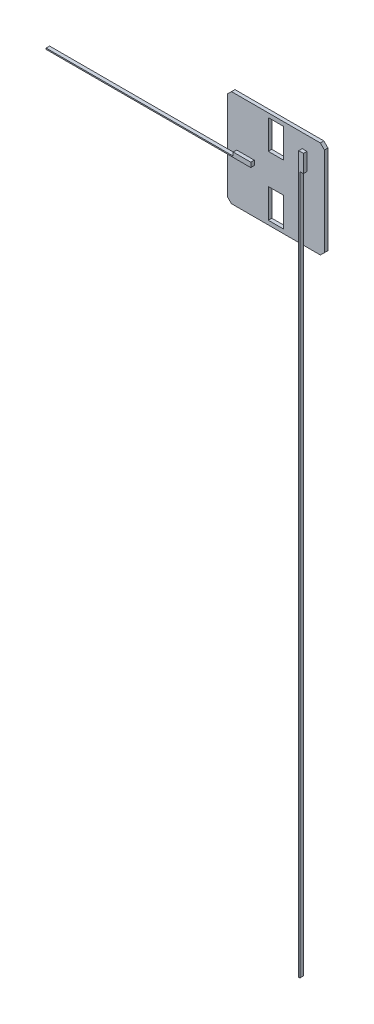
ISO-10303-21;
HEADER;
FILE_DESCRIPTION(('STEP AP214'),'2;1');
FILE_NAME('part.step','',(''),(''),'','','');
FILE_SCHEMA(('AUTOMOTIVE_DESIGN { 1 0 10303 214 1 1 1 1 }'));
ENDSEC;
DATA;
#1=APPLICATION_CONTEXT('core data for automotive mechanical design processes');
#2=APPLICATION_PROTOCOL_DEFINITION('international standard','automotive_design',2000,#1);
#3=PRODUCT_CONTEXT('',#1,'mechanical');
#4=PRODUCT('Part','Part','',(#3));
#5=PRODUCT_RELATED_PRODUCT_CATEGORY('part','',(#4));
#6=PRODUCT_DEFINITION_FORMATION('','',#4);
#7=PRODUCT_DEFINITION_CONTEXT('part definition',#1,'design');
#8=PRODUCT_DEFINITION('design','',#6,#7);
#9=PRODUCT_DEFINITION_SHAPE('','',#8);
#10=(LENGTH_UNIT() NAMED_UNIT(*) SI_UNIT(.MILLI.,.METRE.));
#11=(NAMED_UNIT(*) PLANE_ANGLE_UNIT() SI_UNIT($,.RADIAN.));
#12=(NAMED_UNIT(*) SI_UNIT($,.STERADIAN.) SOLID_ANGLE_UNIT());
#13=UNCERTAINTY_MEASURE_WITH_UNIT(LENGTH_MEASURE(1.E-05),#10,'distance_accuracy_value','');
#14=(GEOMETRIC_REPRESENTATION_CONTEXT(3) GLOBAL_UNCERTAINTY_ASSIGNED_CONTEXT((#13)) GLOBAL_UNIT_ASSIGNED_CONTEXT((#10,
#11,#12)) REPRESENTATION_CONTEXT('',''));
#15=CARTESIAN_POINT('',(0.,0.,0.));
#16=DIRECTION('',(0.,0.,1.));
#17=DIRECTION('',(1.,0.,0.));
#18=AXIS2_PLACEMENT_3D('',#15,#16,#17);
#19=CARTESIAN_POINT('',(0.,0.,3.));
#20=DIRECTION('',(0.,0.,1.));
#21=DIRECTION('',(1.,0.,0.));
#22=AXIS2_PLACEMENT_3D('',#19,#20,#21);
#23=PLANE('',#22);
#24=DIRECTION('',(1.,0.,0.));
#25=VECTOR('',#24,1.);
#26=CARTESIAN_POINT('',(-6.50000000000001,-38.,3.));
#27=LINE('',#26,#25);
#28=CARTESIAN_POINT('',(-6.50000000000001,-38.,3.));
#29=VERTEX_POINT('',#28);
#30=CARTESIAN_POINT('',(6.49999999999999,-38.,3.));
#31=VERTEX_POINT('',#30);
#32=EDGE_CURVE('E335',#29,#31,#27,.T.);
#33=ORIENTED_EDGE('',*,*,#32,.F.);
#34=DIRECTION('',(0.,-1.,0.));
#35=VECTOR('',#34,1.);
#36=CARTESIAN_POINT('',(-6.50000000000001,-38.,3.));
#37=LINE('',#36,#35);
#38=CARTESIAN_POINT('',(-6.50000000000001,-13.,3.));
#39=VERTEX_POINT('',#38);
#40=EDGE_CURVE('E340',#39,#29,#37,.T.);
#41=ORIENTED_EDGE('',*,*,#40,.F.);
#42=DIRECTION('',(-1.,0.,0.));
#43=VECTOR('',#42,1.);
#44=CARTESIAN_POINT('',(-6.50000000000001,-13.,3.));
#45=LINE('',#44,#43);
#46=CARTESIAN_POINT('',(6.49999999999999,-13.,3.));
#47=VERTEX_POINT('',#46);
#48=EDGE_CURVE('E354',#47,#39,#45,.T.);
#49=ORIENTED_EDGE('',*,*,#48,.F.);
#50=DIRECTION('',(0.,1.,0.));
#51=VECTOR('',#50,1.);
#52=CARTESIAN_POINT('',(6.49999999999999,-38.,3.));
#53=LINE('',#52,#51);
#54=EDGE_CURVE('E351',#31,#47,#53,.T.);
#55=ORIENTED_EDGE('',*,*,#54,.F.);
#56=EDGE_LOOP('',(#33,#41,#49,#55));
#57=FACE_BOUND('',#56,.T.);
#58=DIRECTION('',(0.,-1.,0.));
#59=VECTOR('',#58,1.);
#60=CARTESIAN_POINT('',(-6.50000000000001,38.,3.));
#61=LINE('',#60,#59);
#62=CARTESIAN_POINT('',(-6.50000000000001,38.,3.));
#63=VERTEX_POINT('',#62);
#64=CARTESIAN_POINT('',(-6.50000000000001,13.,3.));
#65=VERTEX_POINT('',#64);
#66=EDGE_CURVE('E361',#63,#65,#61,.T.);
#67=ORIENTED_EDGE('',*,*,#66,.F.);
#68=DIRECTION('',(-1.,0.,0.));
#69=VECTOR('',#68,1.);
#70=CARTESIAN_POINT('',(-6.50000000000001,38.,3.));
#71=LINE('',#70,#69);
#72=CARTESIAN_POINT('',(6.49999999999999,38.,3.));
#73=VERTEX_POINT('',#72);
#74=EDGE_CURVE('E372',#73,#63,#71,.T.);
#75=ORIENTED_EDGE('',*,*,#74,.F.);
#76=DIRECTION('',(0.,1.,0.));
#77=VECTOR('',#76,1.);
#78=CARTESIAN_POINT('',(6.49999999999999,38.,3.));
#79=LINE('',#78,#77);
#80=CARTESIAN_POINT('',(6.49999999999999,13.,3.));
#81=VERTEX_POINT('',#80);
#82=EDGE_CURVE('E386',#81,#73,#79,.T.);
#83=ORIENTED_EDGE('',*,*,#82,.F.);
#84=DIRECTION('',(1.,0.,0.));
#85=VECTOR('',#84,1.);
#86=CARTESIAN_POINT('',(-6.50000000000001,13.,3.));
#87=LINE('',#86,#85);
#88=EDGE_CURVE('E383',#65,#81,#87,.T.);
#89=ORIENTED_EDGE('',*,*,#88,.F.);
#90=EDGE_LOOP('',(#67,#75,#83,#89));
#91=FACE_BOUND('',#90,.T.);
#92=DIRECTION('',(0.,1.,0.));
#93=VECTOR('',#92,1.);
#94=CARTESIAN_POINT('',(-18.5,0.500000000000007,3.));
#95=LINE('',#94,#93);
#96=CARTESIAN_POINT('',(-18.5,-3.49999999999999,3.));
#97=VERTEX_POINT('',#96);
#98=CARTESIAN_POINT('',(-18.5,0.500000000000007,3.));
#99=VERTEX_POINT('',#98);
#100=EDGE_CURVE('E327',#97,#99,#95,.T.);
#101=ORIENTED_EDGE('',*,*,#100,.F.);
#102=DIRECTION('',(1.,0.,0.));
#103=VECTOR('',#102,1.);
#104=CARTESIAN_POINT('',(-193.5,-3.49999999999999,3.));
#105=LINE('',#104,#103);
#106=CARTESIAN_POINT('',(-41.5,-3.49999999999999,3.));
#107=VERTEX_POINT('',#106);
#108=EDGE_CURVE('E247',#107,#97,#105,.T.);
#109=ORIENTED_EDGE('',*,*,#108,.F.);
#110=DIRECTION('',(0.,-1.,0.));
#111=VECTOR('',#110,1.);
#112=CARTESIAN_POINT('',(-41.5,-41.5,3.));
#113=LINE('',#112,#111);
#114=CARTESIAN_POINT('',(-41.5,-38.,3.));
#115=VERTEX_POINT('',#114);
#116=EDGE_CURVE('E404',#107,#115,#113,.T.);
#117=ORIENTED_EDGE('',*,*,#116,.T.);
#118=DIRECTION('',(-0.707106781186546,0.707106781186549,0.));
#119=VECTOR('',#118,1.);
#120=CARTESIAN_POINT('',(-39.7500000000001,-39.7499999999999,3.));
#121=LINE('',#120,#119);
#122=CARTESIAN_POINT('',(-38.,-41.5,3.));
#123=VERTEX_POINT('',#122);
#124=EDGE_CURVE('E451',#115,#123,#121,.F.);
#125=ORIENTED_EDGE('',*,*,#124,.T.);
#126=DIRECTION('',(1.,0.,0.));
#127=VECTOR('',#126,1.);
#128=CARTESIAN_POINT('',(41.5,-41.5,3.));
#129=LINE('',#128,#127);
#130=CARTESIAN_POINT('',(22.5,-41.5,3.));
#131=VERTEX_POINT('',#130);
#132=EDGE_CURVE('E405',#123,#131,#129,.T.);
#133=ORIENTED_EDGE('',*,*,#132,.T.);
#134=DIRECTION('',(0.,-1.,0.));
#135=VECTOR('',#134,1.);
#136=CARTESIAN_POINT('',(22.5,-582.5,3.));
#137=LINE('',#136,#135);
#138=CARTESIAN_POINT('',(22.5,29.5,3.));
#139=VERTEX_POINT('',#138);
#140=EDGE_CURVE('E278',#139,#131,#137,.T.);
#141=ORIENTED_EDGE('',*,*,#140,.F.);
#142=DIRECTION('',(-1.,0.,0.));
#143=VECTOR('',#142,1.);
#144=CARTESIAN_POINT('',(23.5,29.5,3.));
#145=LINE('',#144,#143);
#146=CARTESIAN_POINT('',(26.5,29.5,3.));
#147=VERTEX_POINT('',#146);
#148=EDGE_CURVE('E300',#147,#139,#145,.T.);
#149=ORIENTED_EDGE('',*,*,#148,.F.);
#150=DIRECTION('',(0.,1.,0.));
#151=VECTOR('',#150,1.);
#152=CARTESIAN_POINT('',(26.5,29.5,3.));
#153=LINE('',#152,#151);
#154=CARTESIAN_POINT('',(26.5,14.5,3.));
#155=VERTEX_POINT('',#154);
#156=EDGE_CURVE('E305',#155,#147,#153,.T.);
#157=ORIENTED_EDGE('',*,*,#156,.F.);
#158=DIRECTION('',(1.,0.,0.));
#159=VECTOR('',#158,1.);
#160=CARTESIAN_POINT('',(23.5,14.5,3.));
#161=LINE('',#160,#159);
#162=CARTESIAN_POINT('',(23.5,14.5000000000001,3.));
#163=VERTEX_POINT('',#162);
#164=EDGE_CURVE('E296',#163,#155,#161,.T.);
#165=ORIENTED_EDGE('',*,*,#164,.F.);
#166=DIRECTION('',(0.,-1.,0.));
#167=VECTOR('',#166,1.);
#168=CARTESIAN_POINT('',(23.5,-582.5,3.));
#169=LINE('',#168,#167);
#170=CARTESIAN_POINT('',(23.5,-41.5,3.));
#171=VERTEX_POINT('',#170);
#172=EDGE_CURVE('E287',#163,#171,#169,.T.);
#173=ORIENTED_EDGE('',*,*,#172,.T.);
#174=CARTESIAN_POINT('',(38.,-41.5,3.));
#175=VERTEX_POINT('',#174);
#176=EDGE_CURVE('E403',#171,#175,#129,.T.);
#177=ORIENTED_EDGE('',*,*,#176,.T.);
#178=DIRECTION('',(-0.707106781186549,-0.707106781186546,0.));
#179=VECTOR('',#178,1.);
#180=CARTESIAN_POINT('',(39.7499999999999,-39.7500000000001,3.));
#181=LINE('',#180,#179);
#182=CARTESIAN_POINT('',(41.5,-38.,3.));
#183=VERTEX_POINT('',#182);
#184=EDGE_CURVE('E449',#175,#183,#181,.F.);
#185=ORIENTED_EDGE('',*,*,#184,.T.);
#186=DIRECTION('',(0.,1.,0.));
#187=VECTOR('',#186,1.);
#188=CARTESIAN_POINT('',(41.5,-41.5,3.));
#189=LINE('',#188,#187);
#190=CARTESIAN_POINT('',(41.5,38.,3.));
#191=VERTEX_POINT('',#190);
#192=EDGE_CURVE('E408',#183,#191,#189,.T.);
#193=ORIENTED_EDGE('',*,*,#192,.T.);
#194=DIRECTION('',(0.707106781186546,-0.707106781186549,0.));
#195=VECTOR('',#194,1.);
#196=CARTESIAN_POINT('',(39.7500000000001,39.7499999999999,3.));
#197=LINE('',#196,#195);
#198=CARTESIAN_POINT('',(38.,41.5,3.));
#199=VERTEX_POINT('',#198);
#200=EDGE_CURVE('E447',#191,#199,#197,.F.);
#201=ORIENTED_EDGE('',*,*,#200,.T.);
#202=DIRECTION('',(-1.,0.,0.));
#203=VECTOR('',#202,1.);
#204=CARTESIAN_POINT('',(41.5,41.5,3.));
#205=LINE('',#204,#203);
#206=CARTESIAN_POINT('',(-38.,41.5,3.));
#207=VERTEX_POINT('',#206);
#208=EDGE_CURVE('E411',#199,#207,#205,.T.);
#209=ORIENTED_EDGE('',*,*,#208,.T.);
#210=DIRECTION('',(0.707106781186549,0.707106781186546,0.));
#211=VECTOR('',#210,1.);
#212=CARTESIAN_POINT('',(-39.7499999999999,39.7500000000001,3.));
#213=LINE('',#212,#211);
#214=CARTESIAN_POINT('',(-41.5,38.,3.));
#215=VERTEX_POINT('',#214);
#216=EDGE_CURVE('E445',#207,#215,#213,.F.);
#217=ORIENTED_EDGE('',*,*,#216,.T.);
#218=CARTESIAN_POINT('',(-41.5,-2.49999999999999,3.));
#219=VERTEX_POINT('',#218);
#220=EDGE_CURVE('E400',#215,#219,#113,.T.);
#221=ORIENTED_EDGE('',*,*,#220,.T.);
#222=DIRECTION('',(1.,0.,0.));
#223=VECTOR('',#222,1.);
#224=CARTESIAN_POINT('',(-193.5,-2.49999999999999,3.));
#225=LINE('',#224,#223);
#226=CARTESIAN_POINT('',(-33.5,-2.49999999999999,3.));
#227=VERTEX_POINT('',#226);
#228=EDGE_CURVE('E491',#219,#227,#225,.T.);
#229=ORIENTED_EDGE('',*,*,#228,.T.);
#230=DIRECTION('',(0.,-1.,0.));
#231=VECTOR('',#230,1.);
#232=CARTESIAN_POINT('',(-33.5,0.500000000000007,3.));
#233=LINE('',#232,#231);
#234=CARTESIAN_POINT('',(-33.5,0.500000000000007,3.));
#235=VERTEX_POINT('',#234);
#236=EDGE_CURVE('E315',#235,#227,#233,.T.);
#237=ORIENTED_EDGE('',*,*,#236,.F.);
#238=DIRECTION('',(-1.,0.,0.));
#239=VECTOR('',#238,1.);
#240=CARTESIAN_POINT('',(-33.5,0.500000000000007,3.));
#241=LINE('',#240,#239);
#242=EDGE_CURVE('E320',#99,#235,#241,.T.);
#243=ORIENTED_EDGE('',*,*,#242,.F.);
#244=EDGE_LOOP('',(#101,#109,#117,#125,#133,#141,#149,#157,#165,#173,#177,#185,#193,#201,#209,
#217,#221,#229,#237,#243));
#245=FACE_BOUND('',#244,.T.);
#246=ADVANCED_FACE('F35',(#57,#91,#245),#23,.T.);
#247=CARTESIAN_POINT('',(-41.5,-41.5,3.));
#248=DIRECTION('',(1.,0.,0.));
#249=DIRECTION('',(0.,0.,-1.));
#250=AXIS2_PLACEMENT_3D('',#247,#248,#249);
#251=PLANE('',#250);
#252=DIRECTION('',(0.,-1.,0.));
#253=VECTOR('',#252,1.);
#254=CARTESIAN_POINT('',(-41.5,-41.5,0.));
#255=LINE('',#254,#253);
#256=CARTESIAN_POINT('',(-41.5,38.,0.));
#257=VERTEX_POINT('',#256);
#258=CARTESIAN_POINT('',(-41.5,-38.,0.));
#259=VERTEX_POINT('',#258);
#260=EDGE_CURVE('E393',#257,#259,#255,.T.);
#261=ORIENTED_EDGE('',*,*,#260,.T.);
#262=DIRECTION('',(0.,0.,1.));
#263=VECTOR('',#262,1.);
#264=CARTESIAN_POINT('',(-41.5,-38.,3.));
#265=LINE('',#264,#263);
#266=EDGE_CURVE('E442',#259,#115,#265,.T.);
#267=ORIENTED_EDGE('',*,*,#266,.T.);
#268=ORIENTED_EDGE('',*,*,#116,.F.);
#269=DIRECTION('',(0.,-1.,0.));
#270=VECTOR('',#269,1.);
#271=CARTESIAN_POINT('',(-41.5,-41.5,3.));
#272=LINE('',#271,#270);
#273=EDGE_CURVE('E242',#219,#107,#272,.T.);
#274=ORIENTED_EDGE('',*,*,#273,.F.);
#275=ORIENTED_EDGE('',*,*,#220,.F.);
#276=DIRECTION('',(0.,0.,-1.));
#277=VECTOR('',#276,1.);
#278=CARTESIAN_POINT('',(-41.5,38.,3.));
#279=LINE('',#278,#277);
#280=EDGE_CURVE('E439',#215,#257,#279,.T.);
#281=ORIENTED_EDGE('',*,*,#280,.T.);
#282=EDGE_LOOP('',(#261,#267,#268,#274,#275,#281));
#283=FACE_BOUND('',#282,.T.);
#284=ADVANCED_FACE('F471',(#283),#251,.F.);
#285=CARTESIAN_POINT('',(41.5,-41.5,3.));
#286=DIRECTION('',(0.,1.,0.));
#287=DIRECTION('',(-1.,0.,0.));
#288=AXIS2_PLACEMENT_3D('',#285,#286,#287);
#289=PLANE('',#288);
#290=ORIENTED_EDGE('',*,*,#132,.F.);
#291=DIRECTION('',(0.,0.,-1.));
#292=VECTOR('',#291,1.);
#293=CARTESIAN_POINT('',(-38.,-41.5,3.));
#294=LINE('',#293,#292);
#295=CARTESIAN_POINT('',(-38.,-41.5,0.));
#296=VERTEX_POINT('',#295);
#297=EDGE_CURVE('E428',#123,#296,#294,.T.);
#298=ORIENTED_EDGE('',*,*,#297,.T.);
#299=DIRECTION('',(1.,0.,0.));
#300=VECTOR('',#299,1.);
#301=CARTESIAN_POINT('',(41.5,-41.5,0.));
#302=LINE('',#301,#300);
#303=CARTESIAN_POINT('',(38.,-41.5,0.));
#304=VERTEX_POINT('',#303);
#305=EDGE_CURVE('E417',#296,#304,#302,.T.);
#306=ORIENTED_EDGE('',*,*,#305,.T.);
#307=DIRECTION('',(0.,0.,1.));
#308=VECTOR('',#307,1.);
#309=CARTESIAN_POINT('',(38.,-41.5,3.));
#310=LINE('',#309,#308);
#311=EDGE_CURVE('E414',#304,#175,#310,.T.);
#312=ORIENTED_EDGE('',*,*,#311,.T.);
#313=ORIENTED_EDGE('',*,*,#176,.F.);
#314=DIRECTION('',(1.,0.,0.));
#315=VECTOR('',#314,1.);
#316=CARTESIAN_POINT('',(41.5,-41.5,3.));
#317=LINE('',#316,#315);
#318=EDGE_CURVE('E294',#131,#171,#317,.T.);
#319=ORIENTED_EDGE('',*,*,#318,.F.);
#320=EDGE_LOOP('',(#290,#298,#306,#312,#313,#319));
#321=FACE_BOUND('',#320,.T.);
#322=ADVANCED_FACE('F482',(#321),#289,.F.);
#323=CARTESIAN_POINT('',(41.5,-41.5,3.));
#324=DIRECTION('',(-1.,0.,0.));
#325=DIRECTION('',(0.,0.,1.));
#326=AXIS2_PLACEMENT_3D('',#323,#324,#325);
#327=PLANE('',#326);
#328=ORIENTED_EDGE('',*,*,#192,.F.);
#329=DIRECTION('',(0.,0.,-1.));
#330=VECTOR('',#329,1.);
#331=CARTESIAN_POINT('',(41.5,-38.,3.));
#332=LINE('',#331,#330);
#333=CARTESIAN_POINT('',(41.5,-38.,0.));
#334=VERTEX_POINT('',#333);
#335=EDGE_CURVE('E455',#183,#334,#332,.T.);
#336=ORIENTED_EDGE('',*,*,#335,.T.);
#337=DIRECTION('',(0.,1.,0.));
#338=VECTOR('',#337,1.);
#339=CARTESIAN_POINT('',(41.5,-41.5,0.));
#340=LINE('',#339,#338);
#341=CARTESIAN_POINT('',(41.5,38.,0.));
#342=VERTEX_POINT('',#341);
#343=EDGE_CURVE('E420',#334,#342,#340,.T.);
#344=ORIENTED_EDGE('',*,*,#343,.T.);
#345=DIRECTION('',(0.,0.,1.));
#346=VECTOR('',#345,1.);
#347=CARTESIAN_POINT('',(41.5,38.,3.));
#348=LINE('',#347,#346);
#349=EDGE_CURVE('E453',#342,#191,#348,.T.);
#350=ORIENTED_EDGE('',*,*,#349,.T.);
#351=EDGE_LOOP('',(#328,#336,#344,#350));
#352=FACE_BOUND('',#351,.T.);
#353=ADVANCED_FACE('F539',(#352),#327,.F.);
#354=CARTESIAN_POINT('',(41.5,41.5,3.));
#355=DIRECTION('',(0.,-1.,0.));
#356=DIRECTION('',(1.,0.,0.));
#357=AXIS2_PLACEMENT_3D('',#354,#355,#356);
#358=PLANE('',#357);
#359=ORIENTED_EDGE('',*,*,#208,.F.);
#360=DIRECTION('',(0.,0.,-1.));
#361=VECTOR('',#360,1.);
#362=CARTESIAN_POINT('',(38.,41.5,3.));
#363=LINE('',#362,#361);
#364=CARTESIAN_POINT('',(38.,41.5,0.));
#365=VERTEX_POINT('',#364);
#366=EDGE_CURVE('E11',#199,#365,#363,.T.);
#367=ORIENTED_EDGE('',*,*,#366,.T.);
#368=DIRECTION('',(-1.,0.,0.));
#369=VECTOR('',#368,1.);
#370=CARTESIAN_POINT('',(41.5,41.5,0.));
#371=LINE('',#370,#369);
#372=CARTESIAN_POINT('',(-38.,41.5,0.));
#373=VERTEX_POINT('',#372);
#374=EDGE_CURVE('E423',#365,#373,#371,.T.);
#375=ORIENTED_EDGE('',*,*,#374,.T.);
#376=DIRECTION('',(0.,0.,1.));
#377=VECTOR('',#376,1.);
#378=CARTESIAN_POINT('',(-38.,41.5,3.));
#379=LINE('',#378,#377);
#380=EDGE_CURVE('E43',#373,#207,#379,.T.);
#381=ORIENTED_EDGE('',*,*,#380,.T.);
#382=EDGE_LOOP('',(#359,#367,#375,#381));
#383=FACE_BOUND('',#382,.T.);
#384=ADVANCED_FACE('F460',(#383),#358,.F.);
#385=CARTESIAN_POINT('',(0.,0.,0.));
#386=DIRECTION('',(0.,0.,1.));
#387=DIRECTION('',(1.,0.,0.));
#388=AXIS2_PLACEMENT_3D('',#385,#386,#387);
#389=PLANE('',#388);
#390=DIRECTION('',(0.,-1.,0.));
#391=VECTOR('',#390,1.);
#392=CARTESIAN_POINT('',(-6.50000000000001,-38.,0.));
#393=LINE('',#392,#391);
#394=CARTESIAN_POINT('',(-6.50000000000001,-13.,0.));
#395=VERTEX_POINT('',#394);
#396=CARTESIAN_POINT('',(-6.50000000000001,-38.,0.));
#397=VERTEX_POINT('',#396);
#398=EDGE_CURVE('E346',#395,#397,#393,.T.);
#399=ORIENTED_EDGE('',*,*,#398,.T.);
#400=DIRECTION('',(1.,0.,0.));
#401=VECTOR('',#400,1.);
#402=CARTESIAN_POINT('',(-6.50000000000001,-38.,0.));
#403=LINE('',#402,#401);
#404=CARTESIAN_POINT('',(6.49999999999999,-38.,0.));
#405=VERTEX_POINT('',#404);
#406=EDGE_CURVE('E336',#397,#405,#403,.T.);
#407=ORIENTED_EDGE('',*,*,#406,.T.);
#408=DIRECTION('',(0.,1.,0.));
#409=VECTOR('',#408,1.);
#410=CARTESIAN_POINT('',(6.49999999999999,-38.,0.));
#411=LINE('',#410,#409);
#412=CARTESIAN_POINT('',(6.49999999999999,-13.,0.));
#413=VERTEX_POINT('',#412);
#414=EDGE_CURVE('E339',#405,#413,#411,.T.);
#415=ORIENTED_EDGE('',*,*,#414,.T.);
#416=DIRECTION('',(-1.,0.,0.));
#417=VECTOR('',#416,1.);
#418=CARTESIAN_POINT('',(-6.50000000000001,-13.,0.));
#419=LINE('',#418,#417);
#420=EDGE_CURVE('E343',#413,#395,#419,.T.);
#421=ORIENTED_EDGE('',*,*,#420,.T.);
#422=EDGE_LOOP('',(#399,#407,#415,#421));
#423=FACE_BOUND('',#422,.T.);
#424=DIRECTION('',(-1.,0.,0.));
#425=VECTOR('',#424,1.);
#426=CARTESIAN_POINT('',(-6.50000000000001,38.,0.));
#427=LINE('',#426,#425);
#428=CARTESIAN_POINT('',(6.49999999999999,38.,0.));
#429=VERTEX_POINT('',#428);
#430=CARTESIAN_POINT('',(-6.50000000000001,38.,0.));
#431=VERTEX_POINT('',#430);
#432=EDGE_CURVE('E378',#429,#431,#427,.T.);
#433=ORIENTED_EDGE('',*,*,#432,.T.);
#434=DIRECTION('',(0.,-1.,0.));
#435=VECTOR('',#434,1.);
#436=CARTESIAN_POINT('',(-6.50000000000001,38.,0.));
#437=LINE('',#436,#435);
#438=CARTESIAN_POINT('',(-6.50000000000001,13.,0.));
#439=VERTEX_POINT('',#438);
#440=EDGE_CURVE('E368',#431,#439,#437,.T.);
#441=ORIENTED_EDGE('',*,*,#440,.T.);
#442=DIRECTION('',(1.,0.,0.));
#443=VECTOR('',#442,1.);
#444=CARTESIAN_POINT('',(-6.50000000000001,13.,0.));
#445=LINE('',#444,#443);
#446=CARTESIAN_POINT('',(6.49999999999999,13.,0.));
#447=VERTEX_POINT('',#446);
#448=EDGE_CURVE('E371',#439,#447,#445,.T.);
#449=ORIENTED_EDGE('',*,*,#448,.T.);
#450=DIRECTION('',(0.,1.,0.));
#451=VECTOR('',#450,1.);
#452=CARTESIAN_POINT('',(6.49999999999999,38.,0.));
#453=LINE('',#452,#451);
#454=EDGE_CURVE('E375',#447,#429,#453,.T.);
#455=ORIENTED_EDGE('',*,*,#454,.T.);
#456=EDGE_LOOP('',(#433,#441,#449,#455));
#457=FACE_BOUND('',#456,.T.);
#458=ORIENTED_EDGE('',*,*,#305,.F.);
#459=DIRECTION('',(0.707106781186546,-0.707106781186549,0.));
#460=VECTOR('',#459,1.);
#461=CARTESIAN_POINT('',(-38.,-41.5,0.));
#462=LINE('',#461,#460);
#463=EDGE_CURVE('E437',#296,#259,#462,.F.);
#464=ORIENTED_EDGE('',*,*,#463,.T.);
#465=ORIENTED_EDGE('',*,*,#260,.F.);
#466=DIRECTION('',(-0.707106781186549,-0.707106781186546,0.));
#467=VECTOR('',#466,1.);
#468=CARTESIAN_POINT('',(-41.5,38.,0.));
#469=LINE('',#468,#467);
#470=EDGE_CURVE('E431',#257,#373,#469,.F.);
#471=ORIENTED_EDGE('',*,*,#470,.T.);
#472=ORIENTED_EDGE('',*,*,#374,.F.);
#473=DIRECTION('',(-0.707106781186546,0.707106781186549,0.));
#474=VECTOR('',#473,1.);
#475=CARTESIAN_POINT('',(38.,41.5,0.));
#476=LINE('',#475,#474);
#477=EDGE_CURVE('E433',#365,#342,#476,.F.);
#478=ORIENTED_EDGE('',*,*,#477,.T.);
#479=ORIENTED_EDGE('',*,*,#343,.F.);
#480=DIRECTION('',(0.707106781186549,0.707106781186546,0.));
#481=VECTOR('',#480,1.);
#482=CARTESIAN_POINT('',(41.5,-38.,0.));
#483=LINE('',#482,#481);
#484=EDGE_CURVE('E435',#334,#304,#483,.F.);
#485=ORIENTED_EDGE('',*,*,#484,.T.);
#486=EDGE_LOOP('',(#458,#464,#465,#471,#472,#478,#479,#485));
#487=FACE_BOUND('',#486,.T.);
#488=ADVANCED_FACE('F475',(#423,#457,#487),#389,.F.);
#489=CARTESIAN_POINT('',(-6.50000000000001,38.,0.));
#490=DIRECTION('',(-1.,0.,0.));
#491=DIRECTION('',(0.,-1.,0.));
#492=AXIS2_PLACEMENT_3D('',#489,#490,#491);
#493=PLANE('',#492);
#494=ORIENTED_EDGE('',*,*,#66,.T.);
#495=DIRECTION('',(0.,0.,1.));
#496=VECTOR('',#495,1.);
#497=CARTESIAN_POINT('',(-6.50000000000001,13.,0.));
#498=LINE('',#497,#496);
#499=EDGE_CURVE('E381',#439,#65,#498,.T.);
#500=ORIENTED_EDGE('',*,*,#499,.F.);
#501=ORIENTED_EDGE('',*,*,#440,.F.);
#502=DIRECTION('',(0.,0.,1.));
#503=VECTOR('',#502,1.);
#504=CARTESIAN_POINT('',(-6.50000000000001,38.,0.));
#505=LINE('',#504,#503);
#506=EDGE_CURVE('E391',#431,#63,#505,.T.);
#507=ORIENTED_EDGE('',*,*,#506,.T.);
#508=EDGE_LOOP('',(#494,#500,#501,#507));
#509=FACE_BOUND('',#508,.T.);
#510=ADVANCED_FACE('F532',(#509),#493,.F.);
#511=CARTESIAN_POINT('',(-6.50000000000001,38.,0.));
#512=DIRECTION('',(0.,1.,0.));
#513=DIRECTION('',(-1.,0.,0.));
#514=AXIS2_PLACEMENT_3D('',#511,#512,#513);
#515=PLANE('',#514);
#516=ORIENTED_EDGE('',*,*,#74,.T.);
#517=ORIENTED_EDGE('',*,*,#506,.F.);
#518=ORIENTED_EDGE('',*,*,#432,.F.);
#519=DIRECTION('',(0.,0.,1.));
#520=VECTOR('',#519,1.);
#521=CARTESIAN_POINT('',(6.49999999999999,38.,0.));
#522=LINE('',#521,#520);
#523=EDGE_CURVE('E394',#429,#73,#522,.T.);
#524=ORIENTED_EDGE('',*,*,#523,.T.);
#525=EDGE_LOOP('',(#516,#517,#518,#524));
#526=FACE_BOUND('',#525,.T.);
#527=ADVANCED_FACE('F625',(#526),#515,.F.);
#528=CARTESIAN_POINT('',(6.49999999999999,38.,0.));
#529=DIRECTION('',(1.,0.,0.));
#530=DIRECTION('',(0.,1.,0.));
#531=AXIS2_PLACEMENT_3D('',#528,#529,#530);
#532=PLANE('',#531);
#533=ORIENTED_EDGE('',*,*,#82,.T.);
#534=ORIENTED_EDGE('',*,*,#523,.F.);
#535=ORIENTED_EDGE('',*,*,#454,.F.);
#536=DIRECTION('',(0.,0.,1.));
#537=VECTOR('',#536,1.);
#538=CARTESIAN_POINT('',(6.49999999999999,13.,0.));
#539=LINE('',#538,#537);
#540=EDGE_CURVE('E396',#447,#81,#539,.T.);
#541=ORIENTED_EDGE('',*,*,#540,.T.);
#542=EDGE_LOOP('',(#533,#534,#535,#541));
#543=FACE_BOUND('',#542,.T.);
#544=ADVANCED_FACE('F628',(#543),#532,.F.);
#545=CARTESIAN_POINT('',(-6.50000000000001,13.,0.));
#546=DIRECTION('',(0.,-1.,0.));
#547=DIRECTION('',(1.,0.,0.));
#548=AXIS2_PLACEMENT_3D('',#545,#546,#547);
#549=PLANE('',#548);
#550=ORIENTED_EDGE('',*,*,#88,.T.);
#551=ORIENTED_EDGE('',*,*,#540,.F.);
#552=ORIENTED_EDGE('',*,*,#448,.F.);
#553=ORIENTED_EDGE('',*,*,#499,.T.);
#554=EDGE_LOOP('',(#550,#551,#552,#553));
#555=FACE_BOUND('',#554,.T.);
#556=ADVANCED_FACE('F623',(#555),#549,.F.);
#557=CARTESIAN_POINT('',(-6.50000000000001,-38.,0.));
#558=DIRECTION('',(0.,-1.,0.));
#559=DIRECTION('',(1.,0.,0.));
#560=AXIS2_PLACEMENT_3D('',#557,#558,#559);
#561=PLANE('',#560);
#562=ORIENTED_EDGE('',*,*,#32,.T.);
#563=DIRECTION('',(0.,0.,1.));
#564=VECTOR('',#563,1.);
#565=CARTESIAN_POINT('',(6.49999999999999,-38.,0.));
#566=LINE('',#565,#564);
#567=EDGE_CURVE('E349',#405,#31,#566,.T.);
#568=ORIENTED_EDGE('',*,*,#567,.F.);
#569=ORIENTED_EDGE('',*,*,#406,.F.);
#570=DIRECTION('',(0.,0.,1.));
#571=VECTOR('',#570,1.);
#572=CARTESIAN_POINT('',(-6.50000000000001,-38.,0.));
#573=LINE('',#572,#571);
#574=EDGE_CURVE('E359',#397,#29,#573,.T.);
#575=ORIENTED_EDGE('',*,*,#574,.T.);
#576=EDGE_LOOP('',(#562,#568,#569,#575));
#577=FACE_BOUND('',#576,.T.);
#578=ADVANCED_FACE('F613',(#577),#561,.F.);
#579=CARTESIAN_POINT('',(-6.50000000000001,-38.,0.));
#580=DIRECTION('',(-1.,0.,0.));
#581=DIRECTION('',(0.,-1.,0.));
#582=AXIS2_PLACEMENT_3D('',#579,#580,#581);
#583=PLANE('',#582);
#584=ORIENTED_EDGE('',*,*,#40,.T.);
#585=ORIENTED_EDGE('',*,*,#574,.F.);
#586=ORIENTED_EDGE('',*,*,#398,.F.);
#587=DIRECTION('',(0.,0.,1.));
#588=VECTOR('',#587,1.);
#589=CARTESIAN_POINT('',(-6.50000000000001,-13.,0.));
#590=LINE('',#589,#588);
#591=EDGE_CURVE('E362',#395,#39,#590,.T.);
#592=ORIENTED_EDGE('',*,*,#591,.T.);
#593=EDGE_LOOP('',(#584,#585,#586,#592));
#594=FACE_BOUND('',#593,.T.);
#595=ADVANCED_FACE('F609',(#594),#583,.F.);
#596=CARTESIAN_POINT('',(-6.50000000000001,-13.,0.));
#597=DIRECTION('',(0.,1.,0.));
#598=DIRECTION('',(-1.,0.,0.));
#599=AXIS2_PLACEMENT_3D('',#596,#597,#598);
#600=PLANE('',#599);
#601=ORIENTED_EDGE('',*,*,#48,.T.);
#602=ORIENTED_EDGE('',*,*,#591,.F.);
#603=ORIENTED_EDGE('',*,*,#420,.F.);
#604=DIRECTION('',(0.,0.,1.));
#605=VECTOR('',#604,1.);
#606=CARTESIAN_POINT('',(6.49999999999999,-13.,0.));
#607=LINE('',#606,#605);
#608=EDGE_CURVE('E364',#413,#47,#607,.T.);
#609=ORIENTED_EDGE('',*,*,#608,.T.);
#610=EDGE_LOOP('',(#601,#602,#603,#609));
#611=FACE_BOUND('',#610,.T.);
#612=ADVANCED_FACE('F612',(#611),#600,.F.);
#613=CARTESIAN_POINT('',(6.49999999999999,-38.,0.));
#614=DIRECTION('',(1.,0.,0.));
#615=DIRECTION('',(0.,1.,0.));
#616=AXIS2_PLACEMENT_3D('',#613,#614,#615);
#617=PLANE('',#616);
#618=ORIENTED_EDGE('',*,*,#54,.T.);
#619=ORIENTED_EDGE('',*,*,#608,.F.);
#620=ORIENTED_EDGE('',*,*,#414,.F.);
#621=ORIENTED_EDGE('',*,*,#567,.T.);
#622=EDGE_LOOP('',(#618,#619,#620,#621));
#623=FACE_BOUND('',#622,.T.);
#624=ADVANCED_FACE('F548',(#623),#617,.F.);
#625=CARTESIAN_POINT('',(-38.,-41.5,3.));
#626=DIRECTION('',(0.707106781186549,0.707106781186546,0.));
#627=DIRECTION('',(0.,0.,-1.));
#628=AXIS2_PLACEMENT_3D('',#625,#626,#627);
#629=PLANE('',#628);
#630=ORIENTED_EDGE('',*,*,#124,.F.);
#631=ORIENTED_EDGE('',*,*,#266,.F.);
#632=ORIENTED_EDGE('',*,*,#463,.F.);
#633=ORIENTED_EDGE('',*,*,#297,.F.);
#634=EDGE_LOOP('',(#630,#631,#632,#633));
#635=FACE_BOUND('',#634,.T.);
#636=ADVANCED_FACE('F479',(#635),#629,.F.);
#637=CARTESIAN_POINT('',(41.5,-38.,3.));
#638=DIRECTION('',(-0.707106781186546,0.707106781186549,0.));
#639=DIRECTION('',(0.,0.,-1.));
#640=AXIS2_PLACEMENT_3D('',#637,#638,#639);
#641=PLANE('',#640);
#642=ORIENTED_EDGE('',*,*,#184,.F.);
#643=ORIENTED_EDGE('',*,*,#311,.F.);
#644=ORIENTED_EDGE('',*,*,#484,.F.);
#645=ORIENTED_EDGE('',*,*,#335,.F.);
#646=EDGE_LOOP('',(#642,#643,#644,#645));
#647=FACE_BOUND('',#646,.T.);
#648=ADVANCED_FACE('F547',(#647),#641,.F.);
#649=CARTESIAN_POINT('',(38.,41.5,3.));
#650=DIRECTION('',(-0.707106781186549,-0.707106781186546,0.));
#651=DIRECTION('',(0.,0.,-1.));
#652=AXIS2_PLACEMENT_3D('',#649,#650,#651);
#653=PLANE('',#652);
#654=ORIENTED_EDGE('',*,*,#200,.F.);
#655=ORIENTED_EDGE('',*,*,#349,.F.);
#656=ORIENTED_EDGE('',*,*,#477,.F.);
#657=ORIENTED_EDGE('',*,*,#366,.F.);
#658=EDGE_LOOP('',(#654,#655,#656,#657));
#659=FACE_BOUND('',#658,.T.);
#660=ADVANCED_FACE('F550',(#659),#653,.F.);
#661=CARTESIAN_POINT('',(-41.5,38.,3.));
#662=DIRECTION('',(0.707106781186546,-0.707106781186549,0.));
#663=DIRECTION('',(0.,0.,-1.));
#664=AXIS2_PLACEMENT_3D('',#661,#662,#663);
#665=PLANE('',#664);
#666=ORIENTED_EDGE('',*,*,#216,.F.);
#667=ORIENTED_EDGE('',*,*,#380,.F.);
#668=ORIENTED_EDGE('',*,*,#470,.F.);
#669=ORIENTED_EDGE('',*,*,#280,.F.);
#670=EDGE_LOOP('',(#666,#667,#668,#669));
#671=FACE_BOUND('',#670,.T.);
#672=ADVANCED_FACE('F37',(#671),#665,.F.);
#673=CARTESIAN_POINT('',(-33.5,0.500000000000007,6.));
#674=DIRECTION('',(1.,0.,0.));
#675=DIRECTION('',(0.,0.,-1.));
#676=AXIS2_PLACEMENT_3D('',#673,#674,#675);
#677=PLANE('',#676);
#678=ORIENTED_EDGE('',*,*,#236,.T.);
#679=DIRECTION('',(0.,0.,-1.));
#680=VECTOR('',#679,1.);
#681=CARTESIAN_POINT('',(-33.5,-2.49999999999999,6.));
#682=LINE('',#681,#680);
#683=CARTESIAN_POINT('',(-33.5,-2.49999999999999,6.));
#684=VERTEX_POINT('',#683);
#685=EDGE_CURVE('E333',#684,#227,#682,.T.);
#686=ORIENTED_EDGE('',*,*,#685,.F.);
#687=DIRECTION('',(0.,-1.,0.));
#688=VECTOR('',#687,1.);
#689=CARTESIAN_POINT('',(-33.5,0.500000000000007,6.));
#690=LINE('',#689,#688);
#691=CARTESIAN_POINT('',(-33.5,0.500000000000007,6.));
#692=VERTEX_POINT('',#691);
#693=EDGE_CURVE('E316',#692,#684,#690,.T.);
#694=ORIENTED_EDGE('',*,*,#693,.F.);
#695=DIRECTION('',(0.,0.,-1.));
#696=VECTOR('',#695,1.);
#697=CARTESIAN_POINT('',(-33.5,0.500000000000007,6.));
#698=LINE('',#697,#696);
#699=EDGE_CURVE('E324',#692,#235,#698,.T.);
#700=ORIENTED_EDGE('',*,*,#699,.T.);
#701=EDGE_LOOP('',(#678,#686,#694,#700));
#702=FACE_BOUND('',#701,.T.);
#703=ADVANCED_FACE('F498',(#702),#677,.F.);
#704=CARTESIAN_POINT('',(-18.5,0.500000000000007,6.));
#705=DIRECTION('',(-1.,0.,0.));
#706=DIRECTION('',(0.,0.,1.));
#707=AXIS2_PLACEMENT_3D('',#704,#705,#706);
#708=PLANE('',#707);
#709=ORIENTED_EDGE('',*,*,#100,.T.);
#710=DIRECTION('',(0.,0.,-1.));
#711=VECTOR('',#710,1.);
#712=CARTESIAN_POINT('',(-18.5,0.500000000000007,6.));
#713=LINE('',#712,#711);
#714=CARTESIAN_POINT('',(-18.5,0.500000000000007,6.));
#715=VERTEX_POINT('',#714);
#716=EDGE_CURVE('E58',#715,#99,#713,.T.);
#717=ORIENTED_EDGE('',*,*,#716,.F.);
#718=DIRECTION('',(0.,1.,0.));
#719=VECTOR('',#718,1.);
#720=CARTESIAN_POINT('',(-18.5,0.500000000000007,6.));
#721=LINE('',#720,#719);
#722=CARTESIAN_POINT('',(-18.5,-3.49999999999999,6.));
#723=VERTEX_POINT('',#722);
#724=EDGE_CURVE('E319',#723,#715,#721,.T.);
#725=ORIENTED_EDGE('',*,*,#724,.F.);
#726=DIRECTION('',(0.,0.,1.));
#727=VECTOR('',#726,1.);
#728=CARTESIAN_POINT('',(-18.5,-3.49999999999999,3.));
#729=LINE('',#728,#727);
#730=EDGE_CURVE('E246',#97,#723,#729,.T.);
#731=ORIENTED_EDGE('',*,*,#730,.F.);
#732=EDGE_LOOP('',(#709,#717,#725,#731));
#733=FACE_BOUND('',#732,.T.);
#734=ADVANCED_FACE('F504',(#733),#708,.F.);
#735=CARTESIAN_POINT('',(-33.5,0.500000000000007,6.));
#736=DIRECTION('',(0.,-1.,0.));
#737=DIRECTION('',(0.,0.,-1.));
#738=AXIS2_PLACEMENT_3D('',#735,#736,#737);
#739=PLANE('',#738);
#740=ORIENTED_EDGE('',*,*,#242,.T.);
#741=ORIENTED_EDGE('',*,*,#699,.F.);
#742=DIRECTION('',(-1.,0.,0.));
#743=VECTOR('',#742,1.);
#744=CARTESIAN_POINT('',(-33.5,0.500000000000007,6.));
#745=LINE('',#744,#743);
#746=EDGE_CURVE('E322',#715,#692,#745,.T.);
#747=ORIENTED_EDGE('',*,*,#746,.F.);
#748=ORIENTED_EDGE('',*,*,#716,.T.);
#749=EDGE_LOOP('',(#740,#741,#747,#748));
#750=FACE_BOUND('',#749,.T.);
#751=ADVANCED_FACE('F501',(#750),#739,.F.);
#752=CARTESIAN_POINT('',(0.,0.,6.));
#753=DIRECTION('',(0.,0.,1.));
#754=DIRECTION('',(1.,0.,0.));
#755=AXIS2_PLACEMENT_3D('',#752,#753,#754);
#756=PLANE('',#755);
#757=ORIENTED_EDGE('',*,*,#693,.T.);
#758=DIRECTION('',(-1.,0.,0.));
#759=VECTOR('',#758,1.);
#760=CARTESIAN_POINT('',(-193.5,-2.49999999999999,6.));
#761=LINE('',#760,#759);
#762=CARTESIAN_POINT('',(-193.5,-2.49999999999999,6.));
#763=VERTEX_POINT('',#762);
#764=EDGE_CURVE('E258',#684,#763,#761,.T.);
#765=ORIENTED_EDGE('',*,*,#764,.T.);
#766=DIRECTION('',(0.,1.,0.));
#767=VECTOR('',#766,1.);
#768=CARTESIAN_POINT('',(-193.5,-3.49999999999999,6.));
#769=LINE('',#768,#767);
#770=CARTESIAN_POINT('',(-193.5,-3.49999999999999,6.));
#771=VERTEX_POINT('',#770);
#772=EDGE_CURVE('E263',#771,#763,#769,.T.);
#773=ORIENTED_EDGE('',*,*,#772,.F.);
#774=DIRECTION('',(-1.,0.,0.));
#775=VECTOR('',#774,1.);
#776=CARTESIAN_POINT('',(-193.5,-3.49999999999999,6.));
#777=LINE('',#776,#775);
#778=EDGE_CURVE('E254',#723,#771,#777,.T.);
#779=ORIENTED_EDGE('',*,*,#778,.F.);
#780=ORIENTED_EDGE('',*,*,#724,.T.);
#781=ORIENTED_EDGE('',*,*,#746,.T.);
#782=EDGE_LOOP('',(#757,#765,#773,#779,#780,#781));
#783=FACE_BOUND('',#782,.T.);
#784=ADVANCED_FACE('F509',(#783),#756,.T.);
#785=CARTESIAN_POINT('',(23.5,14.5,6.));
#786=DIRECTION('',(0.,1.,0.));
#787=DIRECTION('',(-1.,0.,0.));
#788=AXIS2_PLACEMENT_3D('',#785,#786,#787);
#789=PLANE('',#788);
#790=ORIENTED_EDGE('',*,*,#164,.T.);
#791=DIRECTION('',(0.,0.,-1.));
#792=VECTOR('',#791,1.);
#793=CARTESIAN_POINT('',(26.5,14.5,6.));
#794=LINE('',#793,#792);
#795=CARTESIAN_POINT('',(26.5,14.5,6.));
#796=VERTEX_POINT('',#795);
#797=EDGE_CURVE('E309',#796,#155,#794,.T.);
#798=ORIENTED_EDGE('',*,*,#797,.F.);
#799=DIRECTION('',(1.,0.,0.));
#800=VECTOR('',#799,1.);
#801=CARTESIAN_POINT('',(23.5,14.5,6.));
#802=LINE('',#801,#800);
#803=CARTESIAN_POINT('',(23.5,14.5,6.));
#804=VERTEX_POINT('',#803);
#805=EDGE_CURVE('E297',#804,#796,#802,.T.);
#806=ORIENTED_EDGE('',*,*,#805,.F.);
#807=DIRECTION('',(0.,0.,-1.));
#808=VECTOR('',#807,1.);
#809=CARTESIAN_POINT('',(23.5,14.5,6.));
#810=LINE('',#809,#808);
#811=EDGE_CURVE('E312',#804,#163,#810,.T.);
#812=ORIENTED_EDGE('',*,*,#811,.T.);
#813=EDGE_LOOP('',(#790,#798,#806,#812));
#814=FACE_BOUND('',#813,.T.);
#815=ADVANCED_FACE('F573',(#814),#789,.F.);
#816=CARTESIAN_POINT('',(26.5,29.5,6.));
#817=DIRECTION('',(-1.,0.,0.));
#818=DIRECTION('',(0.,-1.,0.));
#819=AXIS2_PLACEMENT_3D('',#816,#817,#818);
#820=PLANE('',#819);
#821=ORIENTED_EDGE('',*,*,#156,.T.);
#822=DIRECTION('',(0.,0.,-1.));
#823=VECTOR('',#822,1.);
#824=CARTESIAN_POINT('',(26.5,29.5,6.));
#825=LINE('',#824,#823);
#826=CARTESIAN_POINT('',(26.5,29.5,6.));
#827=VERTEX_POINT('',#826);
#828=EDGE_CURVE('E50',#827,#147,#825,.T.);
#829=ORIENTED_EDGE('',*,*,#828,.F.);
#830=DIRECTION('',(0.,1.,0.));
#831=VECTOR('',#830,1.);
#832=CARTESIAN_POINT('',(26.5,29.5,6.));
#833=LINE('',#832,#831);
#834=EDGE_CURVE('E299',#796,#827,#833,.T.);
#835=ORIENTED_EDGE('',*,*,#834,.F.);
#836=ORIENTED_EDGE('',*,*,#797,.T.);
#837=EDGE_LOOP('',(#821,#829,#835,#836));
#838=FACE_BOUND('',#837,.T.);
#839=ADVANCED_FACE('F590',(#838),#820,.F.);
#840=CARTESIAN_POINT('',(23.5,29.5,6.));
#841=DIRECTION('',(0.,-1.,0.));
#842=DIRECTION('',(0.,0.,-1.));
#843=AXIS2_PLACEMENT_3D('',#840,#841,#842);
#844=PLANE('',#843);
#845=ORIENTED_EDGE('',*,*,#148,.T.);
#846=DIRECTION('',(0.,0.,-1.));
#847=VECTOR('',#846,1.);
#848=CARTESIAN_POINT('',(22.5,29.5,6.));
#849=LINE('',#848,#847);
#850=CARTESIAN_POINT('',(22.5,29.5,6.));
#851=VERTEX_POINT('',#850);
#852=EDGE_CURVE('E273',#851,#139,#849,.T.);
#853=ORIENTED_EDGE('',*,*,#852,.F.);
#854=DIRECTION('',(-1.,0.,0.));
#855=VECTOR('',#854,1.);
#856=CARTESIAN_POINT('',(23.5,29.5,6.));
#857=LINE('',#856,#855);
#858=EDGE_CURVE('E302',#827,#851,#857,.T.);
#859=ORIENTED_EDGE('',*,*,#858,.F.);
#860=ORIENTED_EDGE('',*,*,#828,.T.);
#861=EDGE_LOOP('',(#845,#853,#859,#860));
#862=FACE_BOUND('',#861,.T.);
#863=ADVANCED_FACE('F588',(#862),#844,.F.);
#864=CARTESIAN_POINT('',(0.,0.,6.));
#865=DIRECTION('',(0.,0.,1.));
#866=DIRECTION('',(1.,0.,0.));
#867=AXIS2_PLACEMENT_3D('',#864,#865,#866);
#868=PLANE('',#867);
#869=ORIENTED_EDGE('',*,*,#858,.T.);
#870=DIRECTION('',(0.,1.,0.));
#871=VECTOR('',#870,1.);
#872=CARTESIAN_POINT('',(22.5,-582.5,6.));
#873=LINE('',#872,#871);
#874=CARTESIAN_POINT('',(22.5,-582.5,6.));
#875=VERTEX_POINT('',#874);
#876=EDGE_CURVE('E270',#875,#851,#873,.T.);
#877=ORIENTED_EDGE('',*,*,#876,.F.);
#878=DIRECTION('',(1.,0.,0.));
#879=VECTOR('',#878,1.);
#880=CARTESIAN_POINT('',(22.5,-582.5,6.));
#881=LINE('',#880,#879);
#882=CARTESIAN_POINT('',(23.5,-582.5,6.));
#883=VERTEX_POINT('',#882);
#884=EDGE_CURVE('E283',#875,#883,#881,.T.);
#885=ORIENTED_EDGE('',*,*,#884,.T.);
#886=DIRECTION('',(0.,1.,0.));
#887=VECTOR('',#886,1.);
#888=CARTESIAN_POINT('',(23.5,-582.5,6.));
#889=LINE('',#888,#887);
#890=EDGE_CURVE('E265',#883,#804,#889,.T.);
#891=ORIENTED_EDGE('',*,*,#890,.T.);
#892=ORIENTED_EDGE('',*,*,#805,.T.);
#893=ORIENTED_EDGE('',*,*,#834,.T.);
#894=EDGE_LOOP('',(#869,#877,#885,#891,#892,#893));
#895=FACE_BOUND('',#894,.T.);
#896=ADVANCED_FACE('F577',(#895),#868,.T.);
#897=CARTESIAN_POINT('',(22.5,-582.5,3.));
#898=DIRECTION('',(0.,0.,1.));
#899=DIRECTION('',(1.,0.,0.));
#900=AXIS2_PLACEMENT_3D('',#897,#898,#899);
#901=PLANE('',#900);
#902=CARTESIAN_POINT('',(22.5,-582.5,3.));
#903=VERTEX_POINT('',#902);
#904=EDGE_CURVE('E277',#131,#903,#137,.T.);
#905=ORIENTED_EDGE('',*,*,#904,.F.);
#906=ORIENTED_EDGE('',*,*,#318,.T.);
#907=CARTESIAN_POINT('',(23.5,-582.5,3.));
#908=VERTEX_POINT('',#907);
#909=EDGE_CURVE('E285',#171,#908,#169,.T.);
#910=ORIENTED_EDGE('',*,*,#909,.T.);
#911=DIRECTION('',(1.,0.,0.));
#912=VECTOR('',#911,1.);
#913=CARTESIAN_POINT('',(22.5,-582.5,3.));
#914=LINE('',#913,#912);
#915=EDGE_CURVE('E291',#903,#908,#914,.T.);
#916=ORIENTED_EDGE('',*,*,#915,.F.);
#917=EDGE_LOOP('',(#905,#906,#910,#916));
#918=FACE_BOUND('',#917,.T.);
#919=ADVANCED_FACE('F585',(#918),#901,.F.);
#920=CARTESIAN_POINT('',(23.5,0.,0.));
#921=DIRECTION('',(-1.,0.,0.));
#922=DIRECTION('',(0.,0.,1.));
#923=AXIS2_PLACEMENT_3D('',#920,#921,#922);
#924=PLANE('',#923);
#925=ORIENTED_EDGE('',*,*,#172,.F.);
#926=ORIENTED_EDGE('',*,*,#811,.F.);
#927=ORIENTED_EDGE('',*,*,#890,.F.);
#928=DIRECTION('',(0.,0.,1.));
#929=VECTOR('',#928,1.);
#930=CARTESIAN_POINT('',(23.5,-582.5,6.));
#931=LINE('',#930,#929);
#932=EDGE_CURVE('E274',#908,#883,#931,.T.);
#933=ORIENTED_EDGE('',*,*,#932,.F.);
#934=ORIENTED_EDGE('',*,*,#909,.F.);
#935=EDGE_LOOP('',(#925,#926,#927,#933,#934));
#936=FACE_BOUND('',#935,.T.);
#937=ADVANCED_FACE('F568',(#936),#924,.F.);
#938=CARTESIAN_POINT('',(22.5,-582.5,6.));
#939=DIRECTION('',(0.,1.,0.));
#940=DIRECTION('',(0.,0.,1.));
#941=AXIS2_PLACEMENT_3D('',#938,#939,#940);
#942=PLANE('',#941);
#943=ORIENTED_EDGE('',*,*,#932,.T.);
#944=ORIENTED_EDGE('',*,*,#884,.F.);
#945=DIRECTION('',(0.,0.,1.));
#946=VECTOR('',#945,1.);
#947=CARTESIAN_POINT('',(22.5,-582.5,6.));
#948=LINE('',#947,#946);
#949=EDGE_CURVE('E281',#903,#875,#948,.T.);
#950=ORIENTED_EDGE('',*,*,#949,.F.);
#951=ORIENTED_EDGE('',*,*,#915,.T.);
#952=EDGE_LOOP('',(#943,#944,#950,#951));
#953=FACE_BOUND('',#952,.T.);
#954=ADVANCED_FACE('F581',(#953),#942,.F.);
#955=CARTESIAN_POINT('',(22.5,0.,0.));
#956=DIRECTION('',(-1.,0.,0.));
#957=DIRECTION('',(0.,0.,1.));
#958=AXIS2_PLACEMENT_3D('',#955,#956,#957);
#959=PLANE('',#958);
#960=ORIENTED_EDGE('',*,*,#876,.T.);
#961=ORIENTED_EDGE('',*,*,#852,.T.);
#962=ORIENTED_EDGE('',*,*,#140,.T.);
#963=ORIENTED_EDGE('',*,*,#904,.T.);
#964=ORIENTED_EDGE('',*,*,#949,.T.);
#965=EDGE_LOOP('',(#960,#961,#962,#963,#964));
#966=FACE_BOUND('',#965,.T.);
#967=ADVANCED_FACE('F518',(#966),#959,.T.);
#968=CARTESIAN_POINT('',(-193.5,-3.49999999999999,3.));
#969=DIRECTION('',(0.,0.,1.));
#970=DIRECTION('',(1.,0.,0.));
#971=AXIS2_PLACEMENT_3D('',#968,#969,#970);
#972=PLANE('',#971);
#973=CARTESIAN_POINT('',(-193.5,-2.49999999999999,3.));
#974=VERTEX_POINT('',#973);
#975=EDGE_CURVE('E494',#974,#219,#225,.T.);
#976=ORIENTED_EDGE('',*,*,#975,.T.);
#977=ORIENTED_EDGE('',*,*,#273,.T.);
#978=CARTESIAN_POINT('',(-193.5,-3.49999999999999,3.));
#979=VERTEX_POINT('',#978);
#980=EDGE_CURVE('E234',#979,#107,#105,.T.);
#981=ORIENTED_EDGE('',*,*,#980,.F.);
#982=DIRECTION('',(0.,1.,0.));
#983=VECTOR('',#982,1.);
#984=CARTESIAN_POINT('',(-193.5,-3.49999999999999,3.));
#985=LINE('',#984,#983);
#986=EDGE_CURVE('E239',#979,#974,#985,.T.);
#987=ORIENTED_EDGE('',*,*,#986,.T.);
#988=EDGE_LOOP('',(#976,#977,#981,#987));
#989=FACE_BOUND('',#988,.T.);
#990=ADVANCED_FACE('F237',(#989),#972,.F.);
#991=CARTESIAN_POINT('',(0.,-2.49999999999999,0.));
#992=DIRECTION('',(0.,1.,0.));
#993=DIRECTION('',(-1.,0.,0.));
#994=AXIS2_PLACEMENT_3D('',#991,#992,#993);
#995=PLANE('',#994);
#996=ORIENTED_EDGE('',*,*,#685,.T.);
#997=ORIENTED_EDGE('',*,*,#228,.F.);
#998=ORIENTED_EDGE('',*,*,#975,.F.);
#999=DIRECTION('',(0.,0.,-1.));
#1000=VECTOR('',#999,1.);
#1001=CARTESIAN_POINT('',(-193.5,-2.49999999999999,3.));
#1002=LINE('',#1001,#1000);
#1003=EDGE_CURVE('E262',#763,#974,#1002,.T.);
#1004=ORIENTED_EDGE('',*,*,#1003,.F.);
#1005=ORIENTED_EDGE('',*,*,#764,.F.);
#1006=EDGE_LOOP('',(#996,#997,#998,#1004,#1005));
#1007=FACE_BOUND('',#1006,.T.);
#1008=ADVANCED_FACE('F510',(#1007),#995,.T.);
#1009=CARTESIAN_POINT('',(-193.5,-3.49999999999999,3.));
#1010=DIRECTION('',(1.,0.,0.));
#1011=DIRECTION('',(0.,1.,0.));
#1012=AXIS2_PLACEMENT_3D('',#1009,#1010,#1011);
#1013=PLANE('',#1012);
#1014=ORIENTED_EDGE('',*,*,#1003,.T.);
#1015=ORIENTED_EDGE('',*,*,#986,.F.);
#1016=DIRECTION('',(0.,0.,-1.));
#1017=VECTOR('',#1016,1.);
#1018=CARTESIAN_POINT('',(-193.5,-3.49999999999999,3.));
#1019=LINE('',#1018,#1017);
#1020=EDGE_CURVE('E250',#771,#979,#1019,.T.);
#1021=ORIENTED_EDGE('',*,*,#1020,.F.);
#1022=ORIENTED_EDGE('',*,*,#772,.T.);
#1023=EDGE_LOOP('',(#1014,#1015,#1021,#1022));
#1024=FACE_BOUND('',#1023,.T.);
#1025=ADVANCED_FACE('F260',(#1024),#1013,.F.);
#1026=CARTESIAN_POINT('',(0.,-3.49999999999999,0.));
#1027=DIRECTION('',(0.,1.,0.));
#1028=DIRECTION('',(-1.,0.,0.));
#1029=AXIS2_PLACEMENT_3D('',#1026,#1027,#1028);
#1030=PLANE('',#1029);
#1031=ORIENTED_EDGE('',*,*,#1020,.T.);
#1032=ORIENTED_EDGE('',*,*,#980,.T.);
#1033=ORIENTED_EDGE('',*,*,#108,.T.);
#1034=ORIENTED_EDGE('',*,*,#730,.T.);
#1035=ORIENTED_EDGE('',*,*,#778,.T.);
#1036=EDGE_LOOP('',(#1031,#1032,#1033,#1034,#1035));
#1037=FACE_BOUND('',#1036,.T.);
#1038=ADVANCED_FACE('F251',(#1037),#1030,.F.);
#1039=CLOSED_SHELL('',(#246,#284,#322,#353,#384,#488,#510,#527,#544,#556,#578,#595,#612,#624,
#636,#648,#660,#672,#703,#734,#751,#784,#815,#839,#863,#896,#919,#937,#954,#967,#990,#1008,
#1025,#1038));
#1040=MANIFOLD_SOLID_BREP('B2',#1039);
#1041=ADVANCED_BREP_SHAPE_REPRESENTATION('',(#18,#1040),#14);
#1042=SHAPE_DEFINITION_REPRESENTATION(#9,#1041);
ENDSEC;
END-ISO-10303-21;
